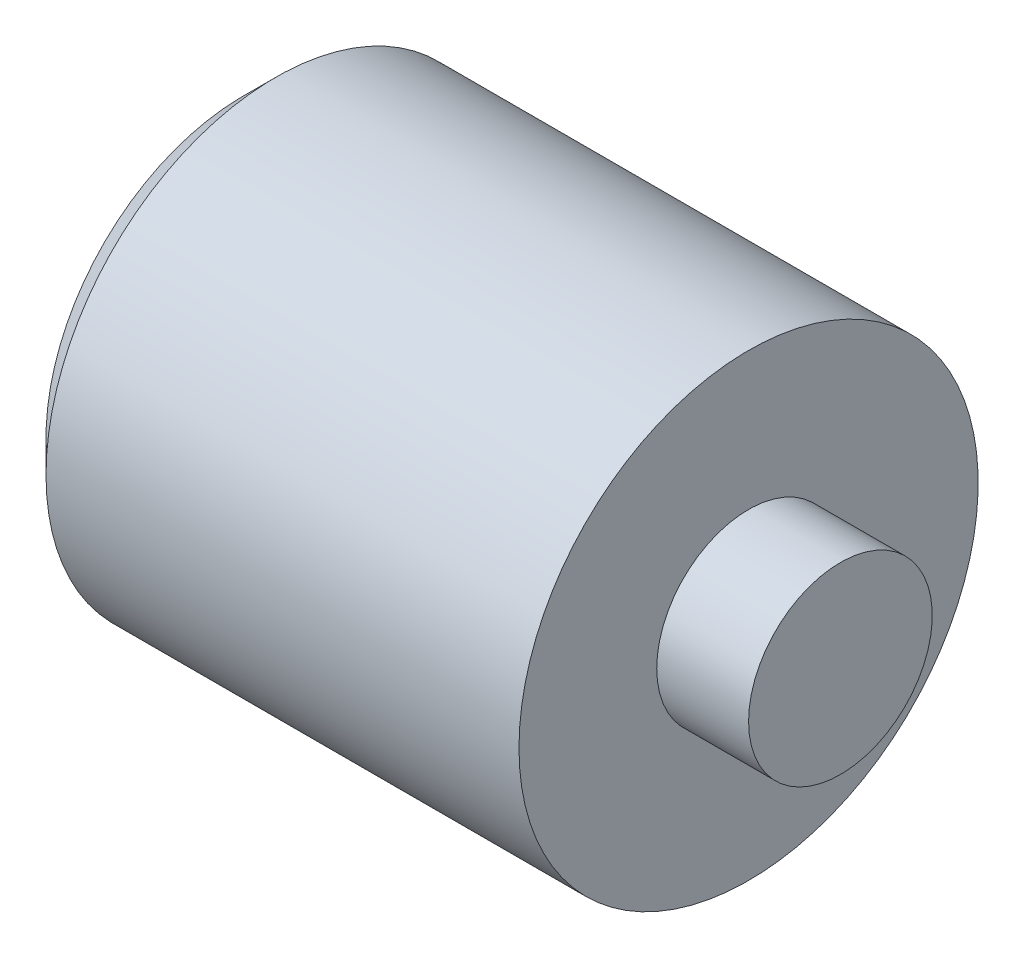
ISO-10303-21;
HEADER;
FILE_DESCRIPTION(('STEP AP214'),'2;1');
FILE_NAME('part.step','',(''),(''),'','','');
FILE_SCHEMA(('AUTOMOTIVE_DESIGN { 1 0 10303 214 1 1 1 1 }'));
ENDSEC;
DATA;
#1=APPLICATION_CONTEXT('core data for automotive mechanical design processes');
#2=APPLICATION_PROTOCOL_DEFINITION('international standard','automotive_design',2000,#1);
#3=PRODUCT_CONTEXT('',#1,'mechanical');
#4=PRODUCT('Part','Part','',(#3));
#5=PRODUCT_RELATED_PRODUCT_CATEGORY('part','',(#4));
#6=PRODUCT_DEFINITION_FORMATION('','',#4);
#7=PRODUCT_DEFINITION_CONTEXT('part definition',#1,'design');
#8=PRODUCT_DEFINITION('design','',#6,#7);
#9=PRODUCT_DEFINITION_SHAPE('','',#8);
#10=(LENGTH_UNIT() NAMED_UNIT(*) SI_UNIT(.MILLI.,.METRE.));
#11=(NAMED_UNIT(*) PLANE_ANGLE_UNIT() SI_UNIT($,.RADIAN.));
#12=(NAMED_UNIT(*) SI_UNIT($,.STERADIAN.) SOLID_ANGLE_UNIT());
#13=UNCERTAINTY_MEASURE_WITH_UNIT(LENGTH_MEASURE(1.E-05),#10,'distance_accuracy_value','');
#14=(GEOMETRIC_REPRESENTATION_CONTEXT(3) GLOBAL_UNCERTAINTY_ASSIGNED_CONTEXT((#13)) GLOBAL_UNIT_ASSIGNED_CONTEXT((#10,
#11,#12)) REPRESENTATION_CONTEXT('',''));
#15=CARTESIAN_POINT('',(0.,0.,0.));
#16=DIRECTION('',(0.,0.,1.));
#17=DIRECTION('',(1.,0.,0.));
#18=AXIS2_PLACEMENT_3D('',#15,#16,#17);
#19=CARTESIAN_POINT('',(0.,5.,0.));
#20=DIRECTION('',(1.,0.,0.));
#21=DIRECTION('',(0.,0.,-1.));
#22=AXIS2_PLACEMENT_3D('',#19,#20,#21);
#23=PLANE('',#22);
#24=CARTESIAN_POINT('',(0.,0.,0.));
#25=DIRECTION('',(1.,0.,0.));
#26=DIRECTION('',(0.,0.,-1.));
#27=AXIS2_PLACEMENT_3D('',#24,#25,#26);
#28=CIRCLE('',#27,4.29999999999999);
#29=CARTESIAN_POINT('',(0.,0.,-4.29999999999999));
#30=VERTEX_POINT('',#29);
#31=EDGE_CURVE('E35',#30,#30,#28,.F.);
#32=ORIENTED_EDGE('',*,*,#31,.T.);
#33=EDGE_LOOP('',(#32));
#34=FACE_BOUND('',#33,.T.);
#35=ADVANCED_FACE('F29',(#34),#23,.F.);
#36=CARTESIAN_POINT('',(0.,0.,0.));
#37=DIRECTION('',(-1.,0.,0.));
#38=DIRECTION('',(0.,0.,1.));
#39=AXIS2_PLACEMENT_3D('',#36,#37,#38);
#40=CYLINDRICAL_SURFACE('',#39,5.);
#41=CARTESIAN_POINT('',(0.700000000000005,0.,0.));
#42=DIRECTION('',(1.,0.,0.));
#43=DIRECTION('',(0.,0.,-1.));
#44=AXIS2_PLACEMENT_3D('',#41,#42,#43);
#45=CIRCLE('',#44,5.);
#46=CARTESIAN_POINT('',(0.700000000000005,0.,-5.));
#47=VERTEX_POINT('',#46);
#48=EDGE_CURVE('E10',#47,#47,#45,.T.);
#49=ORIENTED_EDGE('',*,*,#48,.T.);
#50=EDGE_LOOP('',(#49));
#51=FACE_BOUND('',#50,.T.);
#52=CARTESIAN_POINT('',(11.,0.,0.));
#53=DIRECTION('',(-1.,0.,0.));
#54=DIRECTION('',(0.,0.,1.));
#55=AXIS2_PLACEMENT_3D('',#52,#53,#54);
#56=CIRCLE('',#55,5.);
#57=CARTESIAN_POINT('',(11.,0.,5.));
#58=VERTEX_POINT('',#57);
#59=EDGE_CURVE('E39',#58,#58,#56,.T.);
#60=ORIENTED_EDGE('',*,*,#59,.T.);
#61=EDGE_LOOP('',(#60));
#62=FACE_BOUND('',#61,.T.);
#63=ADVANCED_FACE('F68',(#51,#62),#40,.T.);
#64=CARTESIAN_POINT('',(11.,5.,0.));
#65=DIRECTION('',(1.,0.,0.));
#66=DIRECTION('',(0.,0.,-1.));
#67=AXIS2_PLACEMENT_3D('',#64,#65,#66);
#68=PLANE('',#67);
#69=CARTESIAN_POINT('',(11.,0.,0.));
#70=DIRECTION('',(-1.,0.,0.));
#71=DIRECTION('',(0.,0.,1.));
#72=AXIS2_PLACEMENT_3D('',#69,#70,#71);
#73=CIRCLE('',#72,2.);
#74=CARTESIAN_POINT('',(11.,0.,2.));
#75=VERTEX_POINT('',#74);
#76=EDGE_CURVE('E43',#75,#75,#73,.T.);
#77=ORIENTED_EDGE('',*,*,#76,.T.);
#78=EDGE_LOOP('',(#77));
#79=FACE_BOUND('',#78,.T.);
#80=ORIENTED_EDGE('',*,*,#59,.F.);
#81=EDGE_LOOP('',(#80));
#82=FACE_BOUND('',#81,.T.);
#83=ADVANCED_FACE('F65',(#79,#82),#68,.T.);
#84=CARTESIAN_POINT('',(0.,0.,0.));
#85=DIRECTION('',(-1.,0.,0.));
#86=DIRECTION('',(0.,0.,1.));
#87=AXIS2_PLACEMENT_3D('',#84,#85,#86);
#88=CYLINDRICAL_SURFACE('',#87,2.);
#89=CARTESIAN_POINT('',(13.,0.,0.));
#90=DIRECTION('',(-1.,0.,0.));
#91=DIRECTION('',(0.,0.,1.));
#92=AXIS2_PLACEMENT_3D('',#89,#90,#91);
#93=CIRCLE('',#92,2.);
#94=CARTESIAN_POINT('',(13.,0.,2.));
#95=VERTEX_POINT('',#94);
#96=EDGE_CURVE('E48',#95,#95,#93,.T.);
#97=ORIENTED_EDGE('',*,*,#96,.T.);
#98=EDGE_LOOP('',(#97));
#99=FACE_BOUND('',#98,.T.);
#100=ORIENTED_EDGE('',*,*,#76,.F.);
#101=EDGE_LOOP('',(#100));
#102=FACE_BOUND('',#101,.T.);
#103=ADVANCED_FACE('F52',(#99,#102),#88,.T.);
#104=CARTESIAN_POINT('',(13.,2.,0.));
#105=DIRECTION('',(1.,0.,0.));
#106=DIRECTION('',(0.,0.,-1.));
#107=AXIS2_PLACEMENT_3D('',#104,#105,#106);
#108=PLANE('',#107);
#109=ORIENTED_EDGE('',*,*,#96,.F.);
#110=EDGE_LOOP('',(#109));
#111=FACE_BOUND('',#110,.T.);
#112=ADVANCED_FACE('F55',(#111),#108,.T.);
#113=CARTESIAN_POINT('',(0.,0.,0.));
#114=DIRECTION('',(1.,0.,0.));
#115=DIRECTION('',(0.,0.,-1.));
#116=AXIS2_PLACEMENT_3D('',#113,#114,#115);
#117=CONICAL_SURFACE('',#116,4.29999999999999,0.785398163397454);
#118=ORIENTED_EDGE('',*,*,#48,.F.);
#119=EDGE_LOOP('',(#118));
#120=FACE_BOUND('',#119,.T.);
#121=ORIENTED_EDGE('',*,*,#31,.F.);
#122=EDGE_LOOP('',(#121));
#123=FACE_BOUND('',#122,.T.);
#124=ADVANCED_FACE('F57',(#120,#123),#117,.T.);
#125=CLOSED_SHELL('',(#35,#63,#83,#103,#112,#124));
#126=MANIFOLD_SOLID_BREP('B2',#125);
#127=ADVANCED_BREP_SHAPE_REPRESENTATION('',(#18,#126),#14);
#128=SHAPE_DEFINITION_REPRESENTATION(#9,#127);
ENDSEC;
END-ISO-10303-21;
